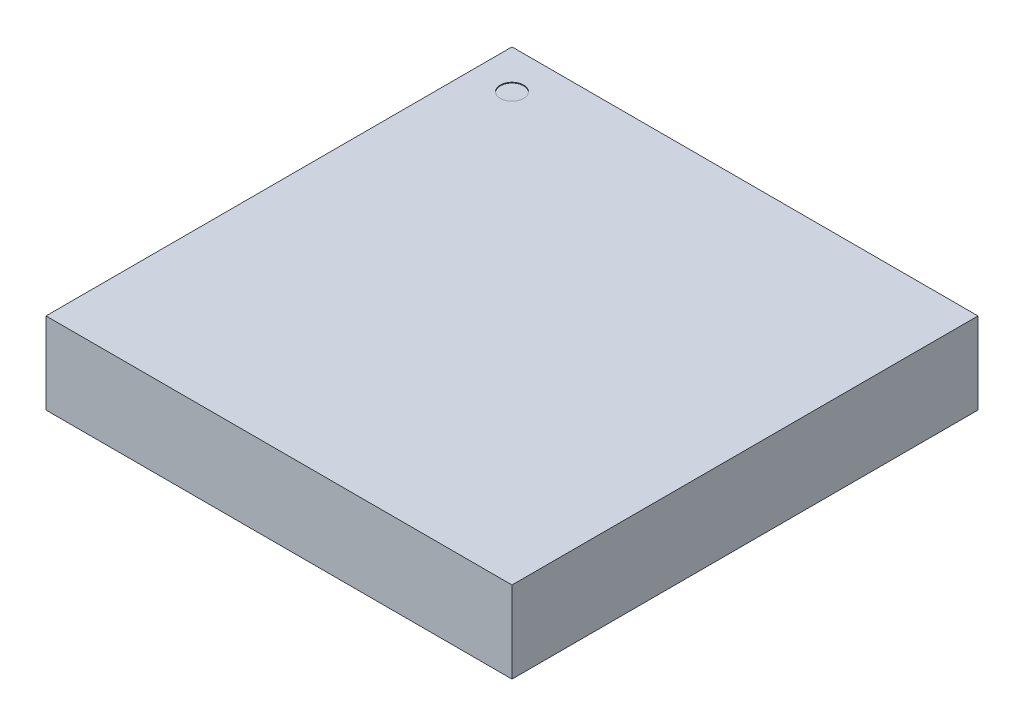
ISO-10303-21;
HEADER;
FILE_DESCRIPTION(('STEP AP214'),'2;1');
FILE_NAME('part.step','',(''),(''),'','','');
FILE_SCHEMA(('AUTOMOTIVE_DESIGN { 1 0 10303 214 1 1 1 1 }'));
ENDSEC;
DATA;
#1=APPLICATION_CONTEXT('core data for automotive mechanical design processes');
#2=APPLICATION_PROTOCOL_DEFINITION('international standard','automotive_design',2000,#1);
#3=PRODUCT_CONTEXT('',#1,'mechanical');
#4=PRODUCT('Part','Part','',(#3));
#5=PRODUCT_RELATED_PRODUCT_CATEGORY('part','',(#4));
#6=PRODUCT_DEFINITION_FORMATION('','',#4);
#7=PRODUCT_DEFINITION_CONTEXT('part definition',#1,'design');
#8=PRODUCT_DEFINITION('design','',#6,#7);
#9=PRODUCT_DEFINITION_SHAPE('','',#8);
#10=(LENGTH_UNIT() NAMED_UNIT(*) SI_UNIT(.MILLI.,.METRE.));
#11=(NAMED_UNIT(*) PLANE_ANGLE_UNIT() SI_UNIT($,.RADIAN.));
#12=(NAMED_UNIT(*) SI_UNIT($,.STERADIAN.) SOLID_ANGLE_UNIT());
#13=UNCERTAINTY_MEASURE_WITH_UNIT(LENGTH_MEASURE(1.E-05),#10,'distance_accuracy_value','');
#14=(GEOMETRIC_REPRESENTATION_CONTEXT(3) GLOBAL_UNCERTAINTY_ASSIGNED_CONTEXT((#13)) GLOBAL_UNIT_ASSIGNED_CONTEXT((#10,
#11,#12)) REPRESENTATION_CONTEXT('',''));
#15=CARTESIAN_POINT('',(0.,0.,0.));
#16=DIRECTION('',(0.,0.,1.));
#17=DIRECTION('',(1.,0.,0.));
#18=AXIS2_PLACEMENT_3D('',#15,#16,#17);
#19=CARTESIAN_POINT('',(-1.78352206498866,1.04,-2.39953280277875));
#20=DIRECTION('',(0.,1.,0.));
#21=DIRECTION('',(1.,0.,0.));
#22=AXIS2_PLACEMENT_3D('',#19,#20,#21);
#23=PLANE('',#22);
#24=CARTESIAN_POINT('',(-1.78352206498866,1.04,-2.39953280277875));
#25=DIRECTION('',(0.,1.,0.));
#26=DIRECTION('',(0.,0.,1.));
#27=AXIS2_PLACEMENT_3D('',#24,#25,#26);
#28=CIRCLE('',#27,0.15);
#29=CARTESIAN_POINT('',(-1.78352206498866,1.04,-2.24953280277875));
#30=VERTEX_POINT('',#29);
#31=CARTESIAN_POINT('',(-1.78352206498866,1.04,-2.54953280277875));
#32=VERTEX_POINT('',#31);
#33=EDGE_CURVE('E11',#30,#32,#28,.T.);
#34=ORIENTED_EDGE('',*,*,#33,.T.);
#35=CARTESIAN_POINT('',(-1.78352206498866,1.04,-2.39953280277875));
#36=DIRECTION('',(0.,1.,0.));
#37=DIRECTION('',(0.,0.,1.));
#38=AXIS2_PLACEMENT_3D('',#35,#36,#37);
#39=CIRCLE('',#38,0.15);
#40=EDGE_CURVE('E147',#32,#30,#39,.T.);
#41=ORIENTED_EDGE('',*,*,#40,.T.);
#42=EDGE_LOOP('',(#34,#41));
#43=FACE_BOUND('',#42,.T.);
#44=ADVANCED_FACE('F16',(#43),#23,.T.);
#45=CARTESIAN_POINT('',(-1.78352206498866,1.04,-2.39953280277875));
#46=DIRECTION('',(0.,1.,0.));
#47=DIRECTION('',(0.,0.,1.));
#48=AXIS2_PLACEMENT_3D('',#45,#46,#47);
#49=CYLINDRICAL_SURFACE('',#48,0.15);
#50=DIRECTION('',(0.,1.,0.));
#51=VECTOR('',#50,1.);
#52=CARTESIAN_POINT('',(-1.78352206498866,1.04,-2.54953280277875));
#53=LINE('',#52,#51);
#54=CARTESIAN_POINT('',(-1.78352206498866,1.05,-2.54953280277875));
#55=VERTEX_POINT('',#54);
#56=EDGE_CURVE('E137',#32,#55,#53,.T.);
#57=ORIENTED_EDGE('',*,*,#56,.F.);
#58=ORIENTED_EDGE('',*,*,#33,.F.);
#59=DIRECTION('',(0.,1.,0.));
#60=VECTOR('',#59,1.);
#61=CARTESIAN_POINT('',(-1.78352206498866,1.04,-2.24953280277875));
#62=LINE('',#61,#60);
#63=CARTESIAN_POINT('',(-1.78352206498866,1.05,-2.24953280277875));
#64=VERTEX_POINT('',#63);
#65=EDGE_CURVE('E123',#30,#64,#62,.T.);
#66=ORIENTED_EDGE('',*,*,#65,.T.);
#67=CARTESIAN_POINT('',(-1.78352206498866,1.05,-2.39953280277875));
#68=DIRECTION('',(0.,1.,0.));
#69=DIRECTION('',(0.,0.,1.));
#70=AXIS2_PLACEMENT_3D('',#67,#68,#69);
#71=CIRCLE('',#70,0.15);
#72=EDGE_CURVE('E27',#64,#55,#71,.T.);
#73=ORIENTED_EDGE('',*,*,#72,.T.);
#74=EDGE_LOOP('',(#57,#58,#66,#73));
#75=FACE_BOUND('',#74,.T.);
#76=ADVANCED_FACE('F178',(#75),#49,.F.);
#77=CARTESIAN_POINT('',(0.,0.,0.));
#78=DIRECTION('',(0.,1.,0.));
#79=DIRECTION('',(1.,0.,0.));
#80=AXIS2_PLACEMENT_3D('',#77,#78,#79);
#81=PLANE('',#80);
#82=DIRECTION('',(0.,0.,1.));
#83=VECTOR('',#82,1.);
#84=CARTESIAN_POINT('',(-2.28352206498866,0.,-2.89953280277875));
#85=LINE('',#84,#83);
#86=CARTESIAN_POINT('',(-2.28352206498866,0.,-2.89953280277875));
#87=VERTEX_POINT('',#86);
#88=CARTESIAN_POINT('',(-2.28352206498865,0.,3.10046719722125));
#89=VERTEX_POINT('',#88);
#90=EDGE_CURVE('E121',#87,#89,#85,.T.);
#91=ORIENTED_EDGE('',*,*,#90,.F.);
#92=DIRECTION('',(-1.,0.,0.));
#93=VECTOR('',#92,1.);
#94=CARTESIAN_POINT('',(-2.28352206498866,0.,-2.89953280277875));
#95=LINE('',#94,#93);
#96=CARTESIAN_POINT('',(3.71647793501135,0.,-2.89953280277875));
#97=VERTEX_POINT('',#96);
#98=EDGE_CURVE('E89',#97,#87,#95,.T.);
#99=ORIENTED_EDGE('',*,*,#98,.F.);
#100=DIRECTION('',(0.,0.,-1.));
#101=VECTOR('',#100,1.);
#102=CARTESIAN_POINT('',(3.71647793501135,0.,-2.89953280277875));
#103=LINE('',#102,#101);
#104=CARTESIAN_POINT('',(3.71647793501135,0.,3.10046719722125));
#105=VERTEX_POINT('',#104);
#106=EDGE_CURVE('E82',#105,#97,#103,.T.);
#107=ORIENTED_EDGE('',*,*,#106,.F.);
#108=DIRECTION('',(1.,0.,0.));
#109=VECTOR('',#108,1.);
#110=CARTESIAN_POINT('',(-2.28352206498865,0.,3.10046719722125));
#111=LINE('',#110,#109);
#112=EDGE_CURVE('E86',#89,#105,#111,.T.);
#113=ORIENTED_EDGE('',*,*,#112,.F.);
#114=EDGE_LOOP('',(#91,#99,#107,#113));
#115=FACE_BOUND('',#114,.T.);
#116=ADVANCED_FACE('F18',(#115),#81,.F.);
#117=CARTESIAN_POINT('',(0.,1.05,0.));
#118=DIRECTION('',(0.,1.,0.));
#119=DIRECTION('',(1.,0.,0.));
#120=AXIS2_PLACEMENT_3D('',#117,#118,#119);
#121=PLANE('',#120);
#122=ORIENTED_EDGE('',*,*,#72,.F.);
#123=CARTESIAN_POINT('',(-1.78352206498866,1.05,-2.39953280277875));
#124=DIRECTION('',(0.,1.,0.));
#125=DIRECTION('',(0.,0.,1.));
#126=AXIS2_PLACEMENT_3D('',#123,#124,#125);
#127=CIRCLE('',#126,0.15);
#128=EDGE_CURVE('E130',#55,#64,#127,.T.);
#129=ORIENTED_EDGE('',*,*,#128,.F.);
#130=EDGE_LOOP('',(#122,#129));
#131=FACE_BOUND('',#130,.T.);
#132=DIRECTION('',(0.,0.,1.));
#133=VECTOR('',#132,1.);
#134=CARTESIAN_POINT('',(-2.28352206498866,1.05,-2.89953280277875));
#135=LINE('',#134,#133);
#136=CARTESIAN_POINT('',(-2.28352206498866,1.05,-2.89953280277875));
#137=VERTEX_POINT('',#136);
#138=CARTESIAN_POINT('',(-2.28352206498865,1.05,3.10046719722125));
#139=VERTEX_POINT('',#138);
#140=EDGE_CURVE('E115',#137,#139,#135,.T.);
#141=ORIENTED_EDGE('',*,*,#140,.T.);
#142=DIRECTION('',(1.,0.,0.));
#143=VECTOR('',#142,1.);
#144=CARTESIAN_POINT('',(-2.28352206498865,1.05,3.10046719722125));
#145=LINE('',#144,#143);
#146=CARTESIAN_POINT('',(3.71647793501135,1.05,3.10046719722125));
#147=VERTEX_POINT('',#146);
#148=EDGE_CURVE('E94',#139,#147,#145,.T.);
#149=ORIENTED_EDGE('',*,*,#148,.T.);
#150=DIRECTION('',(0.,0.,-1.));
#151=VECTOR('',#150,1.);
#152=CARTESIAN_POINT('',(3.71647793501135,1.05,-2.89953280277875));
#153=LINE('',#152,#151);
#154=CARTESIAN_POINT('',(3.71647793501135,1.05,-2.89953280277875));
#155=VERTEX_POINT('',#154);
#156=EDGE_CURVE('E99',#147,#155,#153,.T.);
#157=ORIENTED_EDGE('',*,*,#156,.T.);
#158=DIRECTION('',(-1.,0.,0.));
#159=VECTOR('',#158,1.);
#160=CARTESIAN_POINT('',(-2.28352206498866,1.05,-2.89953280277875));
#161=LINE('',#160,#159);
#162=EDGE_CURVE('E42',#155,#137,#161,.T.);
#163=ORIENTED_EDGE('',*,*,#162,.T.);
#164=EDGE_LOOP('',(#141,#149,#157,#163));
#165=FACE_BOUND('',#164,.T.);
#166=ADVANCED_FACE('F160',(#131,#165),#121,.T.);
#167=CARTESIAN_POINT('',(-2.28352206498866,1.05,-2.89953280277875));
#168=DIRECTION('',(0.,0.,1.));
#169=DIRECTION('',(1.,0.,0.));
#170=AXIS2_PLACEMENT_3D('',#167,#168,#169);
#171=PLANE('',#170);
#172=ORIENTED_EDGE('',*,*,#98,.T.);
#173=DIRECTION('',(0.,-1.,0.));
#174=VECTOR('',#173,1.);
#175=CARTESIAN_POINT('',(-2.28352206498866,1.05,-2.89953280277875));
#176=LINE('',#175,#174);
#177=EDGE_CURVE('E108',#137,#87,#176,.T.);
#178=ORIENTED_EDGE('',*,*,#177,.F.);
#179=ORIENTED_EDGE('',*,*,#162,.F.);
#180=DIRECTION('',(0.,-1.,0.));
#181=VECTOR('',#180,1.);
#182=CARTESIAN_POINT('',(3.71647793501135,1.05,-2.89953280277875));
#183=LINE('',#182,#181);
#184=EDGE_CURVE('E93',#155,#97,#183,.T.);
#185=ORIENTED_EDGE('',*,*,#184,.T.);
#186=EDGE_LOOP('',(#172,#178,#179,#185));
#187=FACE_BOUND('',#186,.T.);
#188=ADVANCED_FACE('F162',(#187),#171,.F.);
#189=CARTESIAN_POINT('',(3.71647793501135,1.05,-2.89953280277875));
#190=DIRECTION('',(-1.,0.,0.));
#191=DIRECTION('',(0.,1.,0.));
#192=AXIS2_PLACEMENT_3D('',#189,#190,#191);
#193=PLANE('',#192);
#194=ORIENTED_EDGE('',*,*,#106,.T.);
#195=ORIENTED_EDGE('',*,*,#184,.F.);
#196=ORIENTED_EDGE('',*,*,#156,.F.);
#197=DIRECTION('',(0.,-1.,0.));
#198=VECTOR('',#197,1.);
#199=CARTESIAN_POINT('',(3.71647793501135,1.05,3.10046719722125));
#200=LINE('',#199,#198);
#201=EDGE_CURVE('E97',#147,#105,#200,.T.);
#202=ORIENTED_EDGE('',*,*,#201,.T.);
#203=EDGE_LOOP('',(#194,#195,#196,#202));
#204=FACE_BOUND('',#203,.T.);
#205=ADVANCED_FACE('F98',(#204),#193,.F.);
#206=CARTESIAN_POINT('',(-2.28352206498865,1.05,3.10046719722125));
#207=DIRECTION('',(0.,0.,-1.));
#208=DIRECTION('',(-1.,0.,0.));
#209=AXIS2_PLACEMENT_3D('',#206,#207,#208);
#210=PLANE('',#209);
#211=ORIENTED_EDGE('',*,*,#112,.T.);
#212=ORIENTED_EDGE('',*,*,#201,.F.);
#213=ORIENTED_EDGE('',*,*,#148,.F.);
#214=DIRECTION('',(0.,-1.,0.));
#215=VECTOR('',#214,1.);
#216=CARTESIAN_POINT('',(-2.28352206498865,1.05,3.10046719722125));
#217=LINE('',#216,#215);
#218=EDGE_CURVE('E20',#139,#89,#217,.T.);
#219=ORIENTED_EDGE('',*,*,#218,.T.);
#220=EDGE_LOOP('',(#211,#212,#213,#219));
#221=FACE_BOUND('',#220,.T.);
#222=ADVANCED_FACE('F104',(#221),#210,.F.);
#223=CARTESIAN_POINT('',(-2.28352206498866,1.05,-2.89953280277875));
#224=DIRECTION('',(1.,0.,0.));
#225=DIRECTION('',(0.,0.,-1.));
#226=AXIS2_PLACEMENT_3D('',#223,#224,#225);
#227=PLANE('',#226);
#228=ORIENTED_EDGE('',*,*,#90,.T.);
#229=ORIENTED_EDGE('',*,*,#218,.F.);
#230=ORIENTED_EDGE('',*,*,#140,.F.);
#231=ORIENTED_EDGE('',*,*,#177,.T.);
#232=EDGE_LOOP('',(#228,#229,#230,#231));
#233=FACE_BOUND('',#232,.T.);
#234=ADVANCED_FACE('F163',(#233),#227,.F.);
#235=CARTESIAN_POINT('',(-1.78352206498866,1.04,-2.39953280277875));
#236=DIRECTION('',(0.,1.,0.));
#237=DIRECTION('',(0.,0.,1.));
#238=AXIS2_PLACEMENT_3D('',#235,#236,#237);
#239=CYLINDRICAL_SURFACE('',#238,0.15);
#240=ORIENTED_EDGE('',*,*,#40,.F.);
#241=ORIENTED_EDGE('',*,*,#56,.T.);
#242=ORIENTED_EDGE('',*,*,#128,.T.);
#243=ORIENTED_EDGE('',*,*,#65,.F.);
#244=EDGE_LOOP('',(#240,#241,#242,#243));
#245=FACE_BOUND('',#244,.T.);
#246=ADVANCED_FACE('F165',(#245),#239,.F.);
#247=CLOSED_SHELL('',(#44,#76,#116,#166,#188,#205,#222,#234,#246));
#248=MANIFOLD_SOLID_BREP('B1',#247);
#249=ADVANCED_BREP_SHAPE_REPRESENTATION('',(#18,#248),#14);
#250=SHAPE_DEFINITION_REPRESENTATION(#9,#249);
ENDSEC;
END-ISO-10303-21;
